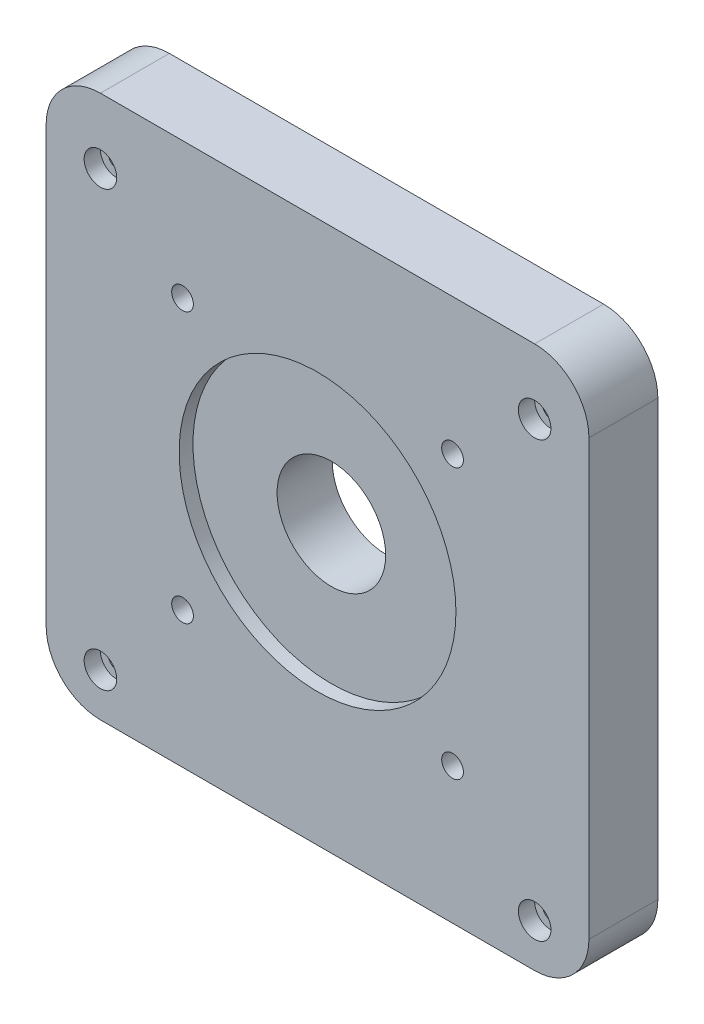
ISO-10303-21;
HEADER;
FILE_DESCRIPTION(('STEP AP214'),'2;1');
FILE_NAME('part.step','',(''),(''),'','','');
FILE_SCHEMA(('AUTOMOTIVE_DESIGN { 1 0 10303 214 1 1 1 1 }'));
ENDSEC;
DATA;
#1=APPLICATION_CONTEXT('core data for automotive mechanical design processes');
#2=APPLICATION_PROTOCOL_DEFINITION('international standard','automotive_design',2000,#1);
#3=PRODUCT_CONTEXT('',#1,'mechanical');
#4=PRODUCT('Part','Part','',(#3));
#5=PRODUCT_RELATED_PRODUCT_CATEGORY('part','',(#4));
#6=PRODUCT_DEFINITION_FORMATION('','',#4);
#7=PRODUCT_DEFINITION_CONTEXT('part definition',#1,'design');
#8=PRODUCT_DEFINITION('design','',#6,#7);
#9=PRODUCT_DEFINITION_SHAPE('','',#8);
#10=(LENGTH_UNIT() NAMED_UNIT(*) SI_UNIT(.MILLI.,.METRE.));
#11=(NAMED_UNIT(*) PLANE_ANGLE_UNIT() SI_UNIT($,.RADIAN.));
#12=(NAMED_UNIT(*) SI_UNIT($,.STERADIAN.) SOLID_ANGLE_UNIT());
#13=UNCERTAINTY_MEASURE_WITH_UNIT(LENGTH_MEASURE(1.E-05),#10,'distance_accuracy_value','');
#14=(GEOMETRIC_REPRESENTATION_CONTEXT(3) GLOBAL_UNCERTAINTY_ASSIGNED_CONTEXT((#13)) GLOBAL_UNIT_ASSIGNED_CONTEXT((#10,
#11,#12)) REPRESENTATION_CONTEXT('',''));
#15=CARTESIAN_POINT('',(0.,0.,0.));
#16=DIRECTION('',(0.,0.,1.));
#17=DIRECTION('',(1.,0.,0.));
#18=AXIS2_PLACEMENT_3D('',#15,#16,#17);
#19=CARTESIAN_POINT('',(50.,50.,-18.3));
#20=DIRECTION('',(0.,0.,1.));
#21=DIRECTION('',(1.,0.,0.));
#22=AXIS2_PLACEMENT_3D('',#19,#20,#21);
#23=CYLINDRICAL_SURFACE('',#22,9.99999999999999);
#24=CARTESIAN_POINT('',(50.,50.,0.));
#25=DIRECTION('',(0.,0.,-1.));
#26=DIRECTION('',(-1.,0.,0.));
#27=AXIS2_PLACEMENT_3D('',#24,#25,#26);
#28=CIRCLE('',#27,9.99999999999999);
#29=CARTESIAN_POINT('',(40.,50.,0.));
#30=VERTEX_POINT('',#29);
#31=EDGE_CURVE('E188',#30,#30,#28,.T.);
#32=ORIENTED_EDGE('',*,*,#31,.T.);
#33=EDGE_LOOP('',(#32));
#34=FACE_BOUND('',#33,.T.);
#35=CARTESIAN_POINT('',(50.,50.,10.15));
#36=DIRECTION('',(0.,0.,1.));
#37=DIRECTION('',(1.,0.,0.));
#38=AXIS2_PLACEMENT_3D('',#35,#36,#37);
#39=CIRCLE('',#38,9.99999999999999);
#40=CARTESIAN_POINT('',(60.,50.,10.15));
#41=VERTEX_POINT('',#40);
#42=EDGE_CURVE('E47',#41,#41,#39,.F.);
#43=ORIENTED_EDGE('',*,*,#42,.F.);
#44=EDGE_LOOP('',(#43));
#45=FACE_BOUND('',#44,.T.);
#46=ADVANCED_FACE('F43',(#34,#45),#23,.F.);
#47=CARTESIAN_POINT('',(25.125,74.875,-18.3));
#48=DIRECTION('',(0.,0.,1.));
#49=DIRECTION('',(1.,0.,0.));
#50=AXIS2_PLACEMENT_3D('',#47,#48,#49);
#51=CYLINDRICAL_SURFACE('',#50,2.);
#52=CARTESIAN_POINT('',(25.125,74.875,12.7));
#53=DIRECTION('',(0.,0.,1.));
#54=DIRECTION('',(1.,0.,0.));
#55=AXIS2_PLACEMENT_3D('',#52,#53,#54);
#56=CIRCLE('',#55,2.);
#57=CARTESIAN_POINT('',(27.125,74.875,12.7));
#58=VERTEX_POINT('',#57);
#59=EDGE_CURVE('E193',#58,#58,#56,.T.);
#60=ORIENTED_EDGE('',*,*,#59,.T.);
#61=EDGE_LOOP('',(#60));
#62=FACE_BOUND('',#61,.T.);
#63=CARTESIAN_POINT('',(25.125,74.875,3.));
#64=DIRECTION('',(0.,0.,-1.));
#65=DIRECTION('',(-1.,0.,0.));
#66=AXIS2_PLACEMENT_3D('',#63,#64,#65);
#67=CIRCLE('',#66,2.);
#68=CARTESIAN_POINT('',(23.125,74.875,3.));
#69=VERTEX_POINT('',#68);
#70=EDGE_CURVE('E224',#69,#69,#67,.F.);
#71=ORIENTED_EDGE('',*,*,#70,.F.);
#72=EDGE_LOOP('',(#71));
#73=FACE_BOUND('',#72,.T.);
#74=ADVANCED_FACE('F351',(#62,#73),#51,.F.);
#75=CARTESIAN_POINT('',(74.875,74.875,-18.3));
#76=DIRECTION('',(0.,0.,1.));
#77=DIRECTION('',(1.,0.,0.));
#78=AXIS2_PLACEMENT_3D('',#75,#76,#77);
#79=CYLINDRICAL_SURFACE('',#78,2.);
#80=CARTESIAN_POINT('',(74.875,74.875,12.7));
#81=DIRECTION('',(0.,0.,1.));
#82=DIRECTION('',(1.,0.,0.));
#83=AXIS2_PLACEMENT_3D('',#80,#81,#82);
#84=CIRCLE('',#83,2.);
#85=CARTESIAN_POINT('',(76.875,74.875,12.7));
#86=VERTEX_POINT('',#85);
#87=EDGE_CURVE('E248',#86,#86,#84,.T.);
#88=ORIENTED_EDGE('',*,*,#87,.T.);
#89=EDGE_LOOP('',(#88));
#90=FACE_BOUND('',#89,.T.);
#91=CARTESIAN_POINT('',(74.875,74.875,3.));
#92=DIRECTION('',(0.,0.,-1.));
#93=DIRECTION('',(-1.,0.,0.));
#94=AXIS2_PLACEMENT_3D('',#91,#92,#93);
#95=CIRCLE('',#94,2.);
#96=CARTESIAN_POINT('',(72.875,74.875,3.));
#97=VERTEX_POINT('',#96);
#98=EDGE_CURVE('E221',#97,#97,#95,.F.);
#99=ORIENTED_EDGE('',*,*,#98,.F.);
#100=EDGE_LOOP('',(#99));
#101=FACE_BOUND('',#100,.T.);
#102=ADVANCED_FACE('F357',(#90,#101),#79,.F.);
#103=CARTESIAN_POINT('',(25.125,25.125,-18.3));
#104=DIRECTION('',(0.,0.,1.));
#105=DIRECTION('',(1.,0.,0.));
#106=AXIS2_PLACEMENT_3D('',#103,#104,#105);
#107=CYLINDRICAL_SURFACE('',#106,2.);
#108=CARTESIAN_POINT('',(25.125,25.125,12.7));
#109=DIRECTION('',(0.,0.,1.));
#110=DIRECTION('',(1.,0.,0.));
#111=AXIS2_PLACEMENT_3D('',#108,#109,#110);
#112=CIRCLE('',#111,2.);
#113=CARTESIAN_POINT('',(27.125,25.125,12.7));
#114=VERTEX_POINT('',#113);
#115=EDGE_CURVE('E252',#114,#114,#112,.T.);
#116=ORIENTED_EDGE('',*,*,#115,.T.);
#117=EDGE_LOOP('',(#116));
#118=FACE_BOUND('',#117,.T.);
#119=CARTESIAN_POINT('',(25.125,25.125,3.));
#120=DIRECTION('',(0.,0.,-1.));
#121=DIRECTION('',(-1.,0.,0.));
#122=AXIS2_PLACEMENT_3D('',#119,#120,#121);
#123=CIRCLE('',#122,2.);
#124=CARTESIAN_POINT('',(23.125,25.125,3.));
#125=VERTEX_POINT('',#124);
#126=EDGE_CURVE('E216',#125,#125,#123,.F.);
#127=ORIENTED_EDGE('',*,*,#126,.F.);
#128=EDGE_LOOP('',(#127));
#129=FACE_BOUND('',#128,.T.);
#130=ADVANCED_FACE('F442',(#118,#129),#107,.F.);
#131=CARTESIAN_POINT('',(74.875,25.125,-18.3));
#132=DIRECTION('',(0.,0.,1.));
#133=DIRECTION('',(1.,0.,0.));
#134=AXIS2_PLACEMENT_3D('',#131,#132,#133);
#135=CYLINDRICAL_SURFACE('',#134,2.);
#136=CARTESIAN_POINT('',(74.875,25.125,12.7));
#137=DIRECTION('',(0.,0.,1.));
#138=DIRECTION('',(1.,0.,0.));
#139=AXIS2_PLACEMENT_3D('',#136,#137,#138);
#140=CIRCLE('',#139,2.);
#141=CARTESIAN_POINT('',(76.875,25.125,12.7));
#142=VERTEX_POINT('',#141);
#143=EDGE_CURVE('E211',#142,#142,#140,.T.);
#144=ORIENTED_EDGE('',*,*,#143,.T.);
#145=EDGE_LOOP('',(#144));
#146=FACE_BOUND('',#145,.T.);
#147=CARTESIAN_POINT('',(74.875,25.125,3.));
#148=DIRECTION('',(0.,0.,-1.));
#149=DIRECTION('',(-1.,0.,0.));
#150=AXIS2_PLACEMENT_3D('',#147,#148,#149);
#151=CIRCLE('',#150,2.);
#152=CARTESIAN_POINT('',(72.875,25.125,3.));
#153=VERTEX_POINT('',#152);
#154=EDGE_CURVE('E212',#153,#153,#151,.F.);
#155=ORIENTED_EDGE('',*,*,#154,.F.);
#156=EDGE_LOOP('',(#155));
#157=FACE_BOUND('',#156,.T.);
#158=ADVANCED_FACE('F362',(#146,#157),#135,.F.);
#159=CARTESIAN_POINT('',(90.,90.,12.7));
#160=DIRECTION('',(0.,0.,-1.));
#161=DIRECTION('',(-1.,0.,0.));
#162=AXIS2_PLACEMENT_3D('',#159,#160,#161);
#163=CYLINDRICAL_SURFACE('',#162,9.99999999999999);
#164=CARTESIAN_POINT('',(90.,90.,0.));
#165=DIRECTION('',(0.,0.,1.));
#166=DIRECTION('',(-1.,0.,0.));
#167=AXIS2_PLACEMENT_3D('',#164,#165,#166);
#168=CIRCLE('',#167,9.99999999999999);
#169=CARTESIAN_POINT('',(100.,89.9999999999999,0.));
#170=VERTEX_POINT('',#169);
#171=CARTESIAN_POINT('',(89.9999999999999,100.,0.));
#172=VERTEX_POINT('',#171);
#173=EDGE_CURVE('E147',#170,#172,#168,.T.);
#174=ORIENTED_EDGE('',*,*,#173,.T.);
#175=DIRECTION('',(0.,0.,-1.));
#176=VECTOR('',#175,1.);
#177=CARTESIAN_POINT('',(89.9999999999999,100.,12.7));
#178=LINE('',#177,#176);
#179=CARTESIAN_POINT('',(89.9999999999999,100.,12.7));
#180=VERTEX_POINT('',#179);
#181=EDGE_CURVE('E11',#180,#172,#178,.T.);
#182=ORIENTED_EDGE('',*,*,#181,.F.);
#183=CARTESIAN_POINT('',(90.,90.,12.7));
#184=DIRECTION('',(0.,0.,1.));
#185=DIRECTION('',(-1.,0.,0.));
#186=AXIS2_PLACEMENT_3D('',#183,#184,#185);
#187=CIRCLE('',#186,9.99999999999999);
#188=CARTESIAN_POINT('',(100.,89.9999999999999,12.7));
#189=VERTEX_POINT('',#188);
#190=EDGE_CURVE('E170',#189,#180,#187,.T.);
#191=ORIENTED_EDGE('',*,*,#190,.F.);
#192=DIRECTION('',(0.,0.,-1.));
#193=VECTOR('',#192,1.);
#194=CARTESIAN_POINT('',(100.,89.9999999999999,12.7));
#195=LINE('',#194,#193);
#196=EDGE_CURVE('E143',#189,#170,#195,.T.);
#197=ORIENTED_EDGE('',*,*,#196,.T.);
#198=EDGE_LOOP('',(#174,#182,#191,#197));
#199=FACE_BOUND('',#198,.T.);
#200=ADVANCED_FACE('F45',(#199),#163,.T.);
#201=CARTESIAN_POINT('',(10.0000000000001,100.,12.7));
#202=DIRECTION('',(0.,-1.,0.));
#203=DIRECTION('',(0.,0.,-1.));
#204=AXIS2_PLACEMENT_3D('',#201,#202,#203);
#205=PLANE('',#204);
#206=DIRECTION('',(-1.,0.,0.));
#207=VECTOR('',#206,1.);
#208=CARTESIAN_POINT('',(10.0000000000001,100.,0.));
#209=LINE('',#208,#207);
#210=CARTESIAN_POINT('',(10.0000000000001,100.,0.));
#211=VERTEX_POINT('',#210);
#212=EDGE_CURVE('E151',#172,#211,#209,.T.);
#213=ORIENTED_EDGE('',*,*,#212,.T.);
#214=DIRECTION('',(0.,0.,-1.));
#215=VECTOR('',#214,1.);
#216=CARTESIAN_POINT('',(10.0000000000001,100.,12.7));
#217=LINE('',#216,#215);
#218=CARTESIAN_POINT('',(10.0000000000001,100.,12.7));
#219=VERTEX_POINT('',#218);
#220=EDGE_CURVE('E54',#219,#211,#217,.T.);
#221=ORIENTED_EDGE('',*,*,#220,.F.);
#222=DIRECTION('',(-1.,0.,0.));
#223=VECTOR('',#222,1.);
#224=CARTESIAN_POINT('',(10.0000000000001,100.,12.7));
#225=LINE('',#224,#223);
#226=EDGE_CURVE('E106',#180,#219,#225,.T.);
#227=ORIENTED_EDGE('',*,*,#226,.F.);
#228=ORIENTED_EDGE('',*,*,#181,.T.);
#229=EDGE_LOOP('',(#213,#221,#227,#228));
#230=FACE_BOUND('',#229,.T.);
#231=ADVANCED_FACE('F421',(#230),#205,.F.);
#232=CARTESIAN_POINT('',(10.,90.,12.7));
#233=DIRECTION('',(0.,0.,-1.));
#234=DIRECTION('',(-1.,0.,0.));
#235=AXIS2_PLACEMENT_3D('',#232,#233,#234);
#236=CYLINDRICAL_SURFACE('',#235,10.);
#237=CARTESIAN_POINT('',(10.,90.,0.));
#238=DIRECTION('',(0.,0.,1.));
#239=DIRECTION('',(-1.,0.,0.));
#240=AXIS2_PLACEMENT_3D('',#237,#238,#239);
#241=CIRCLE('',#240,10.);
#242=CARTESIAN_POINT('',(0.,89.9999999999999,0.));
#243=VERTEX_POINT('',#242);
#244=EDGE_CURVE('E155',#211,#243,#241,.T.);
#245=ORIENTED_EDGE('',*,*,#244,.T.);
#246=DIRECTION('',(0.,0.,-1.));
#247=VECTOR('',#246,1.);
#248=CARTESIAN_POINT('',(0.,89.9999999999999,12.7));
#249=LINE('',#248,#247);
#250=CARTESIAN_POINT('',(0.,89.9999999999999,12.7));
#251=VERTEX_POINT('',#250);
#252=EDGE_CURVE('E181',#251,#243,#249,.T.);
#253=ORIENTED_EDGE('',*,*,#252,.F.);
#254=CARTESIAN_POINT('',(10.,90.,12.7));
#255=DIRECTION('',(0.,0.,1.));
#256=DIRECTION('',(-1.,0.,0.));
#257=AXIS2_PLACEMENT_3D('',#254,#255,#256);
#258=CIRCLE('',#257,10.);
#259=EDGE_CURVE('E293',#219,#251,#258,.T.);
#260=ORIENTED_EDGE('',*,*,#259,.F.);
#261=ORIENTED_EDGE('',*,*,#220,.T.);
#262=EDGE_LOOP('',(#245,#253,#260,#261));
#263=FACE_BOUND('',#262,.T.);
#264=ADVANCED_FACE('F418',(#263),#236,.T.);
#265=CARTESIAN_POINT('',(0.,10.0000000000001,12.7));
#266=DIRECTION('',(1.,0.,0.));
#267=DIRECTION('',(0.,0.,-1.));
#268=AXIS2_PLACEMENT_3D('',#265,#266,#267);
#269=PLANE('',#268);
#270=DIRECTION('',(0.,-1.,0.));
#271=VECTOR('',#270,1.);
#272=CARTESIAN_POINT('',(0.,10.0000000000001,0.));
#273=LINE('',#272,#271);
#274=CARTESIAN_POINT('',(0.,10.0000000000001,0.));
#275=VERTEX_POINT('',#274);
#276=EDGE_CURVE('E158',#243,#275,#273,.T.);
#277=ORIENTED_EDGE('',*,*,#276,.T.);
#278=DIRECTION('',(0.,0.,-1.));
#279=VECTOR('',#278,1.);
#280=CARTESIAN_POINT('',(0.,10.0000000000001,12.7));
#281=LINE('',#280,#279);
#282=CARTESIAN_POINT('',(0.,10.0000000000001,12.7));
#283=VERTEX_POINT('',#282);
#284=EDGE_CURVE('E177',#283,#275,#281,.T.);
#285=ORIENTED_EDGE('',*,*,#284,.F.);
#286=DIRECTION('',(0.,-1.,0.));
#287=VECTOR('',#286,1.);
#288=CARTESIAN_POINT('',(0.,10.0000000000001,12.7));
#289=LINE('',#288,#287);
#290=EDGE_CURVE('E296',#251,#283,#289,.T.);
#291=ORIENTED_EDGE('',*,*,#290,.F.);
#292=ORIENTED_EDGE('',*,*,#252,.T.);
#293=EDGE_LOOP('',(#277,#285,#291,#292));
#294=FACE_BOUND('',#293,.T.);
#295=ADVANCED_FACE('F414',(#294),#269,.F.);
#296=CARTESIAN_POINT('',(10.,10.,12.7));
#297=DIRECTION('',(0.,0.,-1.));
#298=DIRECTION('',(-1.,0.,0.));
#299=AXIS2_PLACEMENT_3D('',#296,#297,#298);
#300=CYLINDRICAL_SURFACE('',#299,10.);
#301=CARTESIAN_POINT('',(10.,10.,0.));
#302=DIRECTION('',(0.,0.,1.));
#303=DIRECTION('',(-1.,0.,0.));
#304=AXIS2_PLACEMENT_3D('',#301,#302,#303);
#305=CIRCLE('',#304,10.);
#306=CARTESIAN_POINT('',(10.0000000000001,0.,0.));
#307=VERTEX_POINT('',#306);
#308=EDGE_CURVE('E161',#275,#307,#305,.T.);
#309=ORIENTED_EDGE('',*,*,#308,.T.);
#310=DIRECTION('',(0.,0.,-1.));
#311=VECTOR('',#310,1.);
#312=CARTESIAN_POINT('',(10.0000000000001,0.,12.7));
#313=LINE('',#312,#311);
#314=CARTESIAN_POINT('',(10.0000000000001,0.,12.7));
#315=VERTEX_POINT('',#314);
#316=EDGE_CURVE('E136',#315,#307,#313,.T.);
#317=ORIENTED_EDGE('',*,*,#316,.F.);
#318=CARTESIAN_POINT('',(10.,10.,12.7));
#319=DIRECTION('',(0.,0.,1.));
#320=DIRECTION('',(-1.,0.,0.));
#321=AXIS2_PLACEMENT_3D('',#318,#319,#320);
#322=CIRCLE('',#321,10.);
#323=EDGE_CURVE('E125',#283,#315,#322,.T.);
#324=ORIENTED_EDGE('',*,*,#323,.F.);
#325=ORIENTED_EDGE('',*,*,#284,.T.);
#326=EDGE_LOOP('',(#309,#317,#324,#325));
#327=FACE_BOUND('',#326,.T.);
#328=ADVANCED_FACE('F411',(#327),#300,.T.);
#329=CARTESIAN_POINT('',(10.0000000000001,0.,12.7));
#330=DIRECTION('',(0.,1.,0.));
#331=DIRECTION('',(0.,0.,1.));
#332=AXIS2_PLACEMENT_3D('',#329,#330,#331);
#333=PLANE('',#332);
#334=DIRECTION('',(1.,0.,0.));
#335=VECTOR('',#334,1.);
#336=CARTESIAN_POINT('',(10.0000000000001,0.,0.));
#337=LINE('',#336,#335);
#338=CARTESIAN_POINT('',(89.9999999999999,0.,0.));
#339=VERTEX_POINT('',#338);
#340=EDGE_CURVE('E134',#307,#339,#337,.T.);
#341=ORIENTED_EDGE('',*,*,#340,.T.);
#342=DIRECTION('',(0.,0.,-1.));
#343=VECTOR('',#342,1.);
#344=CARTESIAN_POINT('',(89.9999999999999,0.,12.7));
#345=LINE('',#344,#343);
#346=CARTESIAN_POINT('',(89.9999999999999,0.,12.7));
#347=VERTEX_POINT('',#346);
#348=EDGE_CURVE('E131',#347,#339,#345,.T.);
#349=ORIENTED_EDGE('',*,*,#348,.F.);
#350=DIRECTION('',(1.,0.,0.));
#351=VECTOR('',#350,1.);
#352=CARTESIAN_POINT('',(10.0000000000001,0.,12.7));
#353=LINE('',#352,#351);
#354=EDGE_CURVE('E119',#315,#347,#353,.T.);
#355=ORIENTED_EDGE('',*,*,#354,.F.);
#356=ORIENTED_EDGE('',*,*,#316,.T.);
#357=EDGE_LOOP('',(#341,#349,#355,#356));
#358=FACE_BOUND('',#357,.T.);
#359=ADVANCED_FACE('F132',(#358),#333,.F.);
#360=CARTESIAN_POINT('',(90.,10.,12.7));
#361=DIRECTION('',(0.,0.,-1.));
#362=DIRECTION('',(-1.,0.,0.));
#363=AXIS2_PLACEMENT_3D('',#360,#361,#362);
#364=CYLINDRICAL_SURFACE('',#363,10.);
#365=CARTESIAN_POINT('',(90.,10.,0.));
#366=DIRECTION('',(0.,0.,1.));
#367=DIRECTION('',(1.,0.,0.));
#368=AXIS2_PLACEMENT_3D('',#365,#366,#367);
#369=CIRCLE('',#368,10.);
#370=CARTESIAN_POINT('',(100.,10.,0.));
#371=VERTEX_POINT('',#370);
#372=EDGE_CURVE('E92',#339,#371,#369,.T.);
#373=ORIENTED_EDGE('',*,*,#372,.T.);
#374=DIRECTION('',(0.,0.,-1.));
#375=VECTOR('',#374,1.);
#376=CARTESIAN_POINT('',(100.,10.,12.7));
#377=LINE('',#376,#375);
#378=CARTESIAN_POINT('',(100.,10.,12.7));
#379=VERTEX_POINT('',#378);
#380=EDGE_CURVE('E137',#379,#371,#377,.T.);
#381=ORIENTED_EDGE('',*,*,#380,.F.);
#382=CARTESIAN_POINT('',(90.,10.,12.7));
#383=DIRECTION('',(0.,0.,1.));
#384=DIRECTION('',(1.,0.,0.));
#385=AXIS2_PLACEMENT_3D('',#382,#383,#384);
#386=CIRCLE('',#385,10.);
#387=EDGE_CURVE('E123',#347,#379,#386,.T.);
#388=ORIENTED_EDGE('',*,*,#387,.F.);
#389=ORIENTED_EDGE('',*,*,#348,.T.);
#390=EDGE_LOOP('',(#373,#381,#388,#389));
#391=FACE_BOUND('',#390,.T.);
#392=ADVANCED_FACE('F139',(#391),#364,.T.);
#393=CARTESIAN_POINT('',(100.,10.0000000000001,12.7));
#394=DIRECTION('',(-1.,0.,0.));
#395=DIRECTION('',(0.,0.,1.));
#396=AXIS2_PLACEMENT_3D('',#393,#394,#395);
#397=PLANE('',#396);
#398=DIRECTION('',(0.,1.,0.));
#399=VECTOR('',#398,1.);
#400=CARTESIAN_POINT('',(100.,10.0000000000001,0.));
#401=LINE('',#400,#399);
#402=EDGE_CURVE('E98',#371,#170,#401,.T.);
#403=ORIENTED_EDGE('',*,*,#402,.T.);
#404=ORIENTED_EDGE('',*,*,#196,.F.);
#405=DIRECTION('',(0.,1.,0.));
#406=VECTOR('',#405,1.);
#407=CARTESIAN_POINT('',(100.,10.0000000000001,12.7));
#408=LINE('',#407,#406);
#409=EDGE_CURVE('E63',#379,#189,#408,.T.);
#410=ORIENTED_EDGE('',*,*,#409,.F.);
#411=ORIENTED_EDGE('',*,*,#380,.T.);
#412=EDGE_LOOP('',(#403,#404,#410,#411));
#413=FACE_BOUND('',#412,.T.);
#414=ADVANCED_FACE('F400',(#413),#397,.F.);
#415=CARTESIAN_POINT('',(90.,90.,12.7));
#416=DIRECTION('',(0.,0.,-1.));
#417=DIRECTION('',(-1.,0.,0.));
#418=AXIS2_PLACEMENT_3D('',#415,#416,#417);
#419=PLANE('',#418);
#420=CARTESIAN_POINT('',(50.,50.,12.7));
#421=DIRECTION('',(0.,0.,1.));
#422=DIRECTION('',(1.,0.,0.));
#423=AXIS2_PLACEMENT_3D('',#420,#421,#422);
#424=CIRCLE('',#423,25.5);
#425=CARTESIAN_POINT('',(75.5,50.,12.7));
#426=VERTEX_POINT('',#425);
#427=EDGE_CURVE('E335',#426,#426,#424,.T.);
#428=ORIENTED_EDGE('',*,*,#427,.F.);
#429=EDGE_LOOP('',(#428));
#430=FACE_BOUND('',#429,.T.);
#431=ORIENTED_EDGE('',*,*,#143,.F.);
#432=EDGE_LOOP('',(#431));
#433=FACE_BOUND('',#432,.T.);
#434=ORIENTED_EDGE('',*,*,#115,.F.);
#435=EDGE_LOOP('',(#434));
#436=FACE_BOUND('',#435,.T.);
#437=ORIENTED_EDGE('',*,*,#87,.F.);
#438=EDGE_LOOP('',(#437));
#439=FACE_BOUND('',#438,.T.);
#440=ORIENTED_EDGE('',*,*,#59,.F.);
#441=EDGE_LOOP('',(#440));
#442=FACE_BOUND('',#441,.T.);
#443=CARTESIAN_POINT('',(10.,7.99999999999999,12.7));
#444=DIRECTION('',(0.,0.,1.));
#445=DIRECTION('',(1.,0.,0.));
#446=AXIS2_PLACEMENT_3D('',#443,#444,#445);
#447=CIRCLE('',#446,3.);
#448=CARTESIAN_POINT('',(13.,7.99999999999999,12.7));
#449=VERTEX_POINT('',#448);
#450=EDGE_CURVE('E267',#449,#449,#447,.T.);
#451=ORIENTED_EDGE('',*,*,#450,.F.);
#452=EDGE_LOOP('',(#451));
#453=FACE_BOUND('',#452,.T.);
#454=CARTESIAN_POINT('',(90.,88.,12.7));
#455=DIRECTION('',(0.,0.,1.));
#456=DIRECTION('',(1.,0.,0.));
#457=AXIS2_PLACEMENT_3D('',#454,#455,#456);
#458=CIRCLE('',#457,3.00000000000001);
#459=CARTESIAN_POINT('',(93.,88.,12.7));
#460=VERTEX_POINT('',#459);
#461=EDGE_CURVE('E276',#460,#460,#458,.T.);
#462=ORIENTED_EDGE('',*,*,#461,.F.);
#463=EDGE_LOOP('',(#462));
#464=FACE_BOUND('',#463,.T.);
#465=CARTESIAN_POINT('',(90.,7.99999999999999,12.7));
#466=DIRECTION('',(0.,0.,1.));
#467=DIRECTION('',(1.,0.,0.));
#468=AXIS2_PLACEMENT_3D('',#465,#466,#467);
#469=CIRCLE('',#468,3.00000000000001);
#470=CARTESIAN_POINT('',(93.,7.99999999999999,12.7));
#471=VERTEX_POINT('',#470);
#472=EDGE_CURVE('E259',#471,#471,#469,.T.);
#473=ORIENTED_EDGE('',*,*,#472,.F.);
#474=EDGE_LOOP('',(#473));
#475=FACE_BOUND('',#474,.T.);
#476=CARTESIAN_POINT('',(10.,88.,12.7));
#477=DIRECTION('',(0.,0.,1.));
#478=DIRECTION('',(1.,0.,0.));
#479=AXIS2_PLACEMENT_3D('',#476,#477,#478);
#480=CIRCLE('',#479,3.);
#481=CARTESIAN_POINT('',(13.,88.,12.7));
#482=VERTEX_POINT('',#481);
#483=EDGE_CURVE('E271',#482,#482,#480,.T.);
#484=ORIENTED_EDGE('',*,*,#483,.F.);
#485=EDGE_LOOP('',(#484));
#486=FACE_BOUND('',#485,.T.);
#487=ORIENTED_EDGE('',*,*,#190,.T.);
#488=ORIENTED_EDGE('',*,*,#226,.T.);
#489=ORIENTED_EDGE('',*,*,#259,.T.);
#490=ORIENTED_EDGE('',*,*,#290,.T.);
#491=ORIENTED_EDGE('',*,*,#323,.T.);
#492=ORIENTED_EDGE('',*,*,#354,.T.);
#493=ORIENTED_EDGE('',*,*,#387,.T.);
#494=ORIENTED_EDGE('',*,*,#409,.T.);
#495=EDGE_LOOP('',(#487,#488,#489,#490,#491,#492,#493,#494));
#496=FACE_BOUND('',#495,.T.);
#497=ADVANCED_FACE('F121',(#430,#433,#436,#439,#442,#453,#464,#475,#486,#496),#419,.F.);
#498=CARTESIAN_POINT('',(90.,90.,0.));
#499=DIRECTION('',(0.,0.,-1.));
#500=DIRECTION('',(-1.,0.,0.));
#501=AXIS2_PLACEMENT_3D('',#498,#499,#500);
#502=PLANE('',#501);
#503=CARTESIAN_POINT('',(74.875,25.125,0.));
#504=DIRECTION('',(0.,0.,-1.));
#505=DIRECTION('',(-1.,0.,0.));
#506=AXIS2_PLACEMENT_3D('',#503,#504,#505);
#507=CIRCLE('',#506,4.00000000000001);
#508=CARTESIAN_POINT('',(70.875,25.125,0.));
#509=VERTEX_POINT('',#508);
#510=EDGE_CURVE('E316',#509,#509,#507,.T.);
#511=ORIENTED_EDGE('',*,*,#510,.F.);
#512=EDGE_LOOP('',(#511));
#513=FACE_BOUND('',#512,.T.);
#514=CARTESIAN_POINT('',(25.125,25.125,0.));
#515=DIRECTION('',(0.,0.,-1.));
#516=DIRECTION('',(-1.,0.,0.));
#517=AXIS2_PLACEMENT_3D('',#514,#515,#516);
#518=CIRCLE('',#517,4.);
#519=CARTESIAN_POINT('',(21.125,25.125,0.));
#520=VERTEX_POINT('',#519);
#521=EDGE_CURVE('E324',#520,#520,#518,.T.);
#522=ORIENTED_EDGE('',*,*,#521,.F.);
#523=EDGE_LOOP('',(#522));
#524=FACE_BOUND('',#523,.T.);
#525=CARTESIAN_POINT('',(25.125,74.875,0.));
#526=DIRECTION('',(0.,0.,-1.));
#527=DIRECTION('',(-1.,0.,0.));
#528=AXIS2_PLACEMENT_3D('',#525,#526,#527);
#529=CIRCLE('',#528,4.);
#530=CARTESIAN_POINT('',(21.125,74.875,0.));
#531=VERTEX_POINT('',#530);
#532=EDGE_CURVE('E308',#531,#531,#529,.T.);
#533=ORIENTED_EDGE('',*,*,#532,.F.);
#534=EDGE_LOOP('',(#533));
#535=FACE_BOUND('',#534,.T.);
#536=CARTESIAN_POINT('',(74.875,74.875,0.));
#537=DIRECTION('',(0.,0.,-1.));
#538=DIRECTION('',(-1.,0.,0.));
#539=AXIS2_PLACEMENT_3D('',#536,#537,#538);
#540=CIRCLE('',#539,4.00000000000001);
#541=CARTESIAN_POINT('',(70.875,74.875,0.));
#542=VERTEX_POINT('',#541);
#543=EDGE_CURVE('E304',#542,#542,#540,.T.);
#544=ORIENTED_EDGE('',*,*,#543,.F.);
#545=EDGE_LOOP('',(#544));
#546=FACE_BOUND('',#545,.T.);
#547=CARTESIAN_POINT('',(10.,7.99999999999999,0.));
#548=DIRECTION('',(0.,0.,-1.));
#549=DIRECTION('',(-1.,0.,0.));
#550=AXIS2_PLACEMENT_3D('',#547,#548,#549);
#551=CIRCLE('',#550,1.5);
#552=CARTESIAN_POINT('',(8.5,7.99999999999999,0.));
#553=VERTEX_POINT('',#552);
#554=EDGE_CURVE('E207',#553,#553,#551,.T.);
#555=ORIENTED_EDGE('',*,*,#554,.F.);
#556=EDGE_LOOP('',(#555));
#557=FACE_BOUND('',#556,.T.);
#558=CARTESIAN_POINT('',(90.,7.99999999999999,0.));
#559=DIRECTION('',(0.,0.,-1.));
#560=DIRECTION('',(-1.,0.,0.));
#561=AXIS2_PLACEMENT_3D('',#558,#559,#560);
#562=CIRCLE('',#561,1.5);
#563=CARTESIAN_POINT('',(88.5,7.99999999999999,0.));
#564=VERTEX_POINT('',#563);
#565=EDGE_CURVE('E203',#564,#564,#562,.T.);
#566=ORIENTED_EDGE('',*,*,#565,.F.);
#567=EDGE_LOOP('',(#566));
#568=FACE_BOUND('',#567,.T.);
#569=CARTESIAN_POINT('',(90.,88.,0.));
#570=DIRECTION('',(0.,0.,-1.));
#571=DIRECTION('',(-1.,0.,0.));
#572=AXIS2_PLACEMENT_3D('',#569,#570,#571);
#573=CIRCLE('',#572,1.5);
#574=CARTESIAN_POINT('',(88.5,88.,0.));
#575=VERTEX_POINT('',#574);
#576=EDGE_CURVE('E198',#575,#575,#573,.T.);
#577=ORIENTED_EDGE('',*,*,#576,.F.);
#578=EDGE_LOOP('',(#577));
#579=FACE_BOUND('',#578,.T.);
#580=CARTESIAN_POINT('',(10.,88.,0.));
#581=DIRECTION('',(0.,0.,-1.));
#582=DIRECTION('',(-1.,0.,0.));
#583=AXIS2_PLACEMENT_3D('',#580,#581,#582);
#584=CIRCLE('',#583,1.5);
#585=CARTESIAN_POINT('',(8.5,88.,0.));
#586=VERTEX_POINT('',#585);
#587=EDGE_CURVE('E194',#586,#586,#584,.T.);
#588=ORIENTED_EDGE('',*,*,#587,.F.);
#589=EDGE_LOOP('',(#588));
#590=FACE_BOUND('',#589,.T.);
#591=ORIENTED_EDGE('',*,*,#31,.F.);
#592=EDGE_LOOP('',(#591));
#593=FACE_BOUND('',#592,.T.);
#594=ORIENTED_EDGE('',*,*,#173,.F.);
#595=ORIENTED_EDGE('',*,*,#402,.F.);
#596=ORIENTED_EDGE('',*,*,#372,.F.);
#597=ORIENTED_EDGE('',*,*,#340,.F.);
#598=ORIENTED_EDGE('',*,*,#308,.F.);
#599=ORIENTED_EDGE('',*,*,#276,.F.);
#600=ORIENTED_EDGE('',*,*,#244,.F.);
#601=ORIENTED_EDGE('',*,*,#212,.F.);
#602=EDGE_LOOP('',(#594,#595,#596,#597,#598,#599,#600,#601));
#603=FACE_BOUND('',#602,.T.);
#604=ADVANCED_FACE('F396',(#513,#524,#535,#546,#557,#568,#579,#590,#593,#603),#502,.T.);
#605=CARTESIAN_POINT('',(10.,88.,9.7));
#606=DIRECTION('',(0.,0.,1.));
#607=DIRECTION('',(1.,0.,0.));
#608=AXIS2_PLACEMENT_3D('',#605,#606,#607);
#609=CYLINDRICAL_SURFACE('',#608,3.);
#610=CARTESIAN_POINT('',(10.,88.,9.7));
#611=DIRECTION('',(0.,0.,1.));
#612=DIRECTION('',(1.,0.,0.));
#613=AXIS2_PLACEMENT_3D('',#610,#611,#612);
#614=CIRCLE('',#613,3.);
#615=CARTESIAN_POINT('',(13.,88.,9.7));
#616=VERTEX_POINT('',#615);
#617=EDGE_CURVE('E152',#616,#616,#614,.T.);
#618=ORIENTED_EDGE('',*,*,#617,.F.);
#619=EDGE_LOOP('',(#618));
#620=FACE_BOUND('',#619,.T.);
#621=ORIENTED_EDGE('',*,*,#483,.T.);
#622=EDGE_LOOP('',(#621));
#623=FACE_BOUND('',#622,.T.);
#624=ADVANCED_FACE('F392',(#620,#623),#609,.F.);
#625=CARTESIAN_POINT('',(10.,88.,9.7));
#626=DIRECTION('',(0.,0.,1.));
#627=DIRECTION('',(1.,0.,0.));
#628=AXIS2_PLACEMENT_3D('',#625,#626,#627);
#629=PLANE('',#628);
#630=CARTESIAN_POINT('',(10.,88.,9.7));
#631=DIRECTION('',(0.,0.,1.));
#632=DIRECTION('',(1.,0.,0.));
#633=AXIS2_PLACEMENT_3D('',#630,#631,#632);
#634=CIRCLE('',#633,1.5);
#635=CARTESIAN_POINT('',(11.5,88.,9.7));
#636=VERTEX_POINT('',#635);
#637=EDGE_CURVE('E199',#636,#636,#634,.T.);
#638=ORIENTED_EDGE('',*,*,#637,.F.);
#639=EDGE_LOOP('',(#638));
#640=FACE_BOUND('',#639,.T.);
#641=ORIENTED_EDGE('',*,*,#617,.T.);
#642=EDGE_LOOP('',(#641));
#643=FACE_BOUND('',#642,.T.);
#644=ADVANCED_FACE('F368',(#640,#643),#629,.T.);
#645=CARTESIAN_POINT('',(90.,7.99999999999999,9.7));
#646=DIRECTION('',(0.,0.,1.));
#647=DIRECTION('',(1.,0.,0.));
#648=AXIS2_PLACEMENT_3D('',#645,#646,#647);
#649=CYLINDRICAL_SURFACE('',#648,3.00000000000001);
#650=CARTESIAN_POINT('',(90.,7.99999999999999,9.7));
#651=DIRECTION('',(0.,0.,1.));
#652=DIRECTION('',(1.,0.,0.));
#653=AXIS2_PLACEMENT_3D('',#650,#651,#652);
#654=CIRCLE('',#653,3.00000000000001);
#655=CARTESIAN_POINT('',(93.,7.99999999999999,9.7));
#656=VERTEX_POINT('',#655);
#657=EDGE_CURVE('E192',#656,#656,#654,.T.);
#658=ORIENTED_EDGE('',*,*,#657,.F.);
#659=EDGE_LOOP('',(#658));
#660=FACE_BOUND('',#659,.T.);
#661=ORIENTED_EDGE('',*,*,#472,.T.);
#662=EDGE_LOOP('',(#661));
#663=FACE_BOUND('',#662,.T.);
#664=ADVANCED_FACE('F364',(#660,#663),#649,.F.);
#665=CARTESIAN_POINT('',(90.,7.99999999999999,9.7));
#666=DIRECTION('',(0.,0.,1.));
#667=DIRECTION('',(1.,0.,0.));
#668=AXIS2_PLACEMENT_3D('',#665,#666,#667);
#669=PLANE('',#668);
#670=CARTESIAN_POINT('',(90.,7.99999999999999,9.7));
#671=DIRECTION('',(0.,0.,1.));
#672=DIRECTION('',(1.,0.,0.));
#673=AXIS2_PLACEMENT_3D('',#670,#671,#672);
#674=CIRCLE('',#673,1.5);
#675=CARTESIAN_POINT('',(91.5,7.99999999999999,9.7));
#676=VERTEX_POINT('',#675);
#677=EDGE_CURVE('E232',#676,#676,#674,.T.);
#678=ORIENTED_EDGE('',*,*,#677,.F.);
#679=EDGE_LOOP('',(#678));
#680=FACE_BOUND('',#679,.T.);
#681=ORIENTED_EDGE('',*,*,#657,.T.);
#682=EDGE_LOOP('',(#681));
#683=FACE_BOUND('',#682,.T.);
#684=ADVANCED_FACE('F367',(#680,#683),#669,.T.);
#685=CARTESIAN_POINT('',(90.,88.,9.7));
#686=DIRECTION('',(0.,0.,1.));
#687=DIRECTION('',(1.,0.,0.));
#688=AXIS2_PLACEMENT_3D('',#685,#686,#687);
#689=CYLINDRICAL_SURFACE('',#688,3.00000000000001);
#690=CARTESIAN_POINT('',(90.,88.,9.7));
#691=DIRECTION('',(0.,0.,1.));
#692=DIRECTION('',(1.,0.,0.));
#693=AXIS2_PLACEMENT_3D('',#690,#691,#692);
#694=CIRCLE('',#693,3.00000000000001);
#695=CARTESIAN_POINT('',(93.,88.,9.7));
#696=VERTEX_POINT('',#695);
#697=EDGE_CURVE('E263',#696,#696,#694,.T.);
#698=ORIENTED_EDGE('',*,*,#697,.F.);
#699=EDGE_LOOP('',(#698));
#700=FACE_BOUND('',#699,.T.);
#701=ORIENTED_EDGE('',*,*,#461,.T.);
#702=EDGE_LOOP('',(#701));
#703=FACE_BOUND('',#702,.T.);
#704=ADVANCED_FACE('F372',(#700,#703),#689,.F.);
#705=CARTESIAN_POINT('',(90.,88.,9.7));
#706=DIRECTION('',(0.,0.,1.));
#707=DIRECTION('',(1.,0.,0.));
#708=AXIS2_PLACEMENT_3D('',#705,#706,#707);
#709=PLANE('',#708);
#710=CARTESIAN_POINT('',(90.,88.,9.7));
#711=DIRECTION('',(0.,0.,1.));
#712=DIRECTION('',(1.,0.,0.));
#713=AXIS2_PLACEMENT_3D('',#710,#711,#712);
#714=CIRCLE('',#713,1.5);
#715=CARTESIAN_POINT('',(91.5,88.,9.7));
#716=VERTEX_POINT('',#715);
#717=EDGE_CURVE('E238',#716,#716,#714,.T.);
#718=ORIENTED_EDGE('',*,*,#717,.F.);
#719=EDGE_LOOP('',(#718));
#720=FACE_BOUND('',#719,.T.);
#721=ORIENTED_EDGE('',*,*,#697,.T.);
#722=EDGE_LOOP('',(#721));
#723=FACE_BOUND('',#722,.T.);
#724=ADVANCED_FACE('F378',(#720,#723),#709,.T.);
#725=CARTESIAN_POINT('',(10.,7.99999999999999,9.7));
#726=DIRECTION('',(0.,0.,1.));
#727=DIRECTION('',(1.,0.,0.));
#728=AXIS2_PLACEMENT_3D('',#725,#726,#727);
#729=CYLINDRICAL_SURFACE('',#728,3.);
#730=CARTESIAN_POINT('',(10.,7.99999999999999,9.7));
#731=DIRECTION('',(0.,0.,1.));
#732=DIRECTION('',(1.,0.,0.));
#733=AXIS2_PLACEMENT_3D('',#730,#731,#732);
#734=CIRCLE('',#733,3.);
#735=CARTESIAN_POINT('',(13.,7.99999999999999,9.7));
#736=VERTEX_POINT('',#735);
#737=EDGE_CURVE('E272',#736,#736,#734,.T.);
#738=ORIENTED_EDGE('',*,*,#737,.F.);
#739=EDGE_LOOP('',(#738));
#740=FACE_BOUND('',#739,.T.);
#741=ORIENTED_EDGE('',*,*,#450,.T.);
#742=EDGE_LOOP('',(#741));
#743=FACE_BOUND('',#742,.T.);
#744=ADVANCED_FACE('F374',(#740,#743),#729,.F.);
#745=CARTESIAN_POINT('',(10.,7.99999999999999,9.7));
#746=DIRECTION('',(0.,0.,1.));
#747=DIRECTION('',(1.,0.,0.));
#748=AXIS2_PLACEMENT_3D('',#745,#746,#747);
#749=PLANE('',#748);
#750=CARTESIAN_POINT('',(10.,7.99999999999999,9.7));
#751=DIRECTION('',(0.,0.,1.));
#752=DIRECTION('',(1.,0.,0.));
#753=AXIS2_PLACEMENT_3D('',#750,#751,#752);
#754=CIRCLE('',#753,1.5);
#755=CARTESIAN_POINT('',(11.5,7.99999999999999,9.7));
#756=VERTEX_POINT('',#755);
#757=EDGE_CURVE('E227',#756,#756,#754,.T.);
#758=ORIENTED_EDGE('',*,*,#757,.F.);
#759=EDGE_LOOP('',(#758));
#760=FACE_BOUND('',#759,.T.);
#761=ORIENTED_EDGE('',*,*,#737,.T.);
#762=EDGE_LOOP('',(#761));
#763=FACE_BOUND('',#762,.T.);
#764=ADVANCED_FACE('F377',(#760,#763),#749,.T.);
#765=CARTESIAN_POINT('',(10.,88.,-21.3));
#766=DIRECTION('',(0.,0.,1.));
#767=DIRECTION('',(1.,0.,0.));
#768=AXIS2_PLACEMENT_3D('',#765,#766,#767);
#769=CYLINDRICAL_SURFACE('',#768,1.5);
#770=ORIENTED_EDGE('',*,*,#587,.T.);
#771=EDGE_LOOP('',(#770));
#772=FACE_BOUND('',#771,.T.);
#773=ORIENTED_EDGE('',*,*,#637,.T.);
#774=EDGE_LOOP('',(#773));
#775=FACE_BOUND('',#774,.T.);
#776=ADVANCED_FACE('F382',(#772,#775),#769,.F.);
#777=CARTESIAN_POINT('',(90.,88.,-21.3));
#778=DIRECTION('',(0.,0.,1.));
#779=DIRECTION('',(1.,0.,0.));
#780=AXIS2_PLACEMENT_3D('',#777,#778,#779);
#781=CYLINDRICAL_SURFACE('',#780,1.5);
#782=ORIENTED_EDGE('',*,*,#576,.T.);
#783=EDGE_LOOP('',(#782));
#784=FACE_BOUND('',#783,.T.);
#785=ORIENTED_EDGE('',*,*,#717,.T.);
#786=EDGE_LOOP('',(#785));
#787=FACE_BOUND('',#786,.T.);
#788=ADVANCED_FACE('F480',(#784,#787),#781,.F.);
#789=CARTESIAN_POINT('',(90.,7.99999999999999,-21.3));
#790=DIRECTION('',(0.,0.,1.));
#791=DIRECTION('',(1.,0.,0.));
#792=AXIS2_PLACEMENT_3D('',#789,#790,#791);
#793=CYLINDRICAL_SURFACE('',#792,1.5);
#794=ORIENTED_EDGE('',*,*,#565,.T.);
#795=EDGE_LOOP('',(#794));
#796=FACE_BOUND('',#795,.T.);
#797=ORIENTED_EDGE('',*,*,#677,.T.);
#798=EDGE_LOOP('',(#797));
#799=FACE_BOUND('',#798,.T.);
#800=ADVANCED_FACE('F465',(#796,#799),#793,.F.);
#801=CARTESIAN_POINT('',(10.,7.99999999999999,-21.3));
#802=DIRECTION('',(0.,0.,1.));
#803=DIRECTION('',(1.,0.,0.));
#804=AXIS2_PLACEMENT_3D('',#801,#802,#803);
#805=CYLINDRICAL_SURFACE('',#804,1.5);
#806=ORIENTED_EDGE('',*,*,#554,.T.);
#807=EDGE_LOOP('',(#806));
#808=FACE_BOUND('',#807,.T.);
#809=ORIENTED_EDGE('',*,*,#757,.T.);
#810=EDGE_LOOP('',(#809));
#811=FACE_BOUND('',#810,.T.);
#812=ADVANCED_FACE('F455',(#808,#811),#805,.F.);
#813=CARTESIAN_POINT('',(74.875,25.125,3.));
#814=DIRECTION('',(0.,0.,-1.));
#815=DIRECTION('',(-1.,0.,0.));
#816=AXIS2_PLACEMENT_3D('',#813,#814,#815);
#817=PLANE('',#816);
#818=CARTESIAN_POINT('',(74.875,25.125,3.));
#819=DIRECTION('',(0.,0.,-1.));
#820=DIRECTION('',(-1.,0.,0.));
#821=AXIS2_PLACEMENT_3D('',#818,#819,#820);
#822=CIRCLE('',#821,4.00000000000001);
#823=CARTESIAN_POINT('',(70.875,25.125,3.));
#824=VERTEX_POINT('',#823);
#825=EDGE_CURVE('E312',#824,#824,#822,.T.);
#826=ORIENTED_EDGE('',*,*,#825,.T.);
#827=EDGE_LOOP('',(#826));
#828=FACE_BOUND('',#827,.T.);
#829=ORIENTED_EDGE('',*,*,#154,.T.);
#830=EDGE_LOOP('',(#829));
#831=FACE_BOUND('',#830,.T.);
#832=ADVANCED_FACE('F452',(#828,#831),#817,.T.);
#833=CARTESIAN_POINT('',(74.875,25.125,3.));
#834=DIRECTION('',(0.,0.,-1.));
#835=DIRECTION('',(-1.,0.,0.));
#836=AXIS2_PLACEMENT_3D('',#833,#834,#835);
#837=CYLINDRICAL_SURFACE('',#836,4.00000000000001);
#838=ORIENTED_EDGE('',*,*,#825,.F.);
#839=EDGE_LOOP('',(#838));
#840=FACE_BOUND('',#839,.T.);
#841=ORIENTED_EDGE('',*,*,#510,.T.);
#842=EDGE_LOOP('',(#841));
#843=FACE_BOUND('',#842,.T.);
#844=ADVANCED_FACE('F454',(#840,#843),#837,.F.);
#845=CARTESIAN_POINT('',(25.125,25.125,3.));
#846=DIRECTION('',(0.,0.,-1.));
#847=DIRECTION('',(-1.,0.,0.));
#848=AXIS2_PLACEMENT_3D('',#845,#846,#847);
#849=PLANE('',#848);
#850=CARTESIAN_POINT('',(25.125,25.125,3.));
#851=DIRECTION('',(0.,0.,-1.));
#852=DIRECTION('',(-1.,0.,0.));
#853=AXIS2_PLACEMENT_3D('',#850,#851,#852);
#854=CIRCLE('',#853,4.);
#855=CARTESIAN_POINT('',(21.125,25.125,3.));
#856=VERTEX_POINT('',#855);
#857=EDGE_CURVE('E320',#856,#856,#854,.T.);
#858=ORIENTED_EDGE('',*,*,#857,.T.);
#859=EDGE_LOOP('',(#858));
#860=FACE_BOUND('',#859,.T.);
#861=ORIENTED_EDGE('',*,*,#126,.T.);
#862=EDGE_LOOP('',(#861));
#863=FACE_BOUND('',#862,.T.);
#864=ADVANCED_FACE('F462',(#860,#863),#849,.T.);
#865=CARTESIAN_POINT('',(25.125,25.125,3.));
#866=DIRECTION('',(0.,0.,-1.));
#867=DIRECTION('',(-1.,0.,0.));
#868=AXIS2_PLACEMENT_3D('',#865,#866,#867);
#869=CYLINDRICAL_SURFACE('',#868,4.);
#870=ORIENTED_EDGE('',*,*,#857,.F.);
#871=EDGE_LOOP('',(#870));
#872=FACE_BOUND('',#871,.T.);
#873=ORIENTED_EDGE('',*,*,#521,.T.);
#874=EDGE_LOOP('',(#873));
#875=FACE_BOUND('',#874,.T.);
#876=ADVANCED_FACE('F474',(#872,#875),#869,.F.);
#877=CARTESIAN_POINT('',(74.875,74.875,3.));
#878=DIRECTION('',(0.,0.,-1.));
#879=DIRECTION('',(-1.,0.,0.));
#880=AXIS2_PLACEMENT_3D('',#877,#878,#879);
#881=PLANE('',#880);
#882=CARTESIAN_POINT('',(74.875,74.875,3.));
#883=DIRECTION('',(0.,0.,-1.));
#884=DIRECTION('',(-1.,0.,0.));
#885=AXIS2_PLACEMENT_3D('',#882,#883,#884);
#886=CIRCLE('',#885,4.00000000000001);
#887=CARTESIAN_POINT('',(70.875,74.875,3.));
#888=VERTEX_POINT('',#887);
#889=EDGE_CURVE('E217',#888,#888,#886,.T.);
#890=ORIENTED_EDGE('',*,*,#889,.T.);
#891=EDGE_LOOP('',(#890));
#892=FACE_BOUND('',#891,.T.);
#893=ORIENTED_EDGE('',*,*,#98,.T.);
#894=EDGE_LOOP('',(#893));
#895=FACE_BOUND('',#894,.T.);
#896=ADVANCED_FACE('F470',(#892,#895),#881,.T.);
#897=CARTESIAN_POINT('',(74.875,74.875,3.));
#898=DIRECTION('',(0.,0.,-1.));
#899=DIRECTION('',(-1.,0.,0.));
#900=AXIS2_PLACEMENT_3D('',#897,#898,#899);
#901=CYLINDRICAL_SURFACE('',#900,4.00000000000001);
#902=ORIENTED_EDGE('',*,*,#889,.F.);
#903=EDGE_LOOP('',(#902));
#904=FACE_BOUND('',#903,.T.);
#905=ORIENTED_EDGE('',*,*,#543,.T.);
#906=EDGE_LOOP('',(#905));
#907=FACE_BOUND('',#906,.T.);
#908=ADVANCED_FACE('F473',(#904,#907),#901,.F.);
#909=CARTESIAN_POINT('',(25.125,74.875,3.));
#910=DIRECTION('',(0.,0.,-1.));
#911=DIRECTION('',(-1.,0.,0.));
#912=AXIS2_PLACEMENT_3D('',#909,#910,#911);
#913=PLANE('',#912);
#914=CARTESIAN_POINT('',(25.125,74.875,3.));
#915=DIRECTION('',(0.,0.,-1.));
#916=DIRECTION('',(-1.,0.,0.));
#917=AXIS2_PLACEMENT_3D('',#914,#915,#916);
#918=CIRCLE('',#917,4.);
#919=CARTESIAN_POINT('',(21.125,74.875,3.));
#920=VERTEX_POINT('',#919);
#921=EDGE_CURVE('E328',#920,#920,#918,.T.);
#922=ORIENTED_EDGE('',*,*,#921,.T.);
#923=EDGE_LOOP('',(#922));
#924=FACE_BOUND('',#923,.T.);
#925=ORIENTED_EDGE('',*,*,#70,.T.);
#926=EDGE_LOOP('',(#925));
#927=FACE_BOUND('',#926,.T.);
#928=ADVANCED_FACE('F478',(#924,#927),#913,.T.);
#929=CARTESIAN_POINT('',(25.125,74.875,3.));
#930=DIRECTION('',(0.,0.,-1.));
#931=DIRECTION('',(-1.,0.,0.));
#932=AXIS2_PLACEMENT_3D('',#929,#930,#931);
#933=CYLINDRICAL_SURFACE('',#932,4.);
#934=ORIENTED_EDGE('',*,*,#921,.F.);
#935=EDGE_LOOP('',(#934));
#936=FACE_BOUND('',#935,.T.);
#937=ORIENTED_EDGE('',*,*,#532,.T.);
#938=EDGE_LOOP('',(#937));
#939=FACE_BOUND('',#938,.T.);
#940=ADVANCED_FACE('F589',(#936,#939),#933,.F.);
#941=CARTESIAN_POINT('',(50.,50.,10.15));
#942=DIRECTION('',(0.,0.,1.));
#943=DIRECTION('',(1.,0.,0.));
#944=AXIS2_PLACEMENT_3D('',#941,#942,#943);
#945=PLANE('',#944);
#946=CARTESIAN_POINT('',(50.,50.,10.15));
#947=DIRECTION('',(0.,0.,1.));
#948=DIRECTION('',(1.,0.,0.));
#949=AXIS2_PLACEMENT_3D('',#946,#947,#948);
#950=CIRCLE('',#949,25.5);
#951=CARTESIAN_POINT('',(75.5,50.,10.15));
#952=VERTEX_POINT('',#951);
#953=EDGE_CURVE('E339',#952,#952,#950,.T.);
#954=ORIENTED_EDGE('',*,*,#953,.T.);
#955=EDGE_LOOP('',(#954));
#956=FACE_BOUND('',#955,.T.);
#957=ORIENTED_EDGE('',*,*,#42,.T.);
#958=EDGE_LOOP('',(#957));
#959=FACE_BOUND('',#958,.T.);
#960=ADVANCED_FACE('F348',(#956,#959),#945,.T.);
#961=CARTESIAN_POINT('',(50.,50.,10.15));
#962=DIRECTION('',(0.,0.,1.));
#963=DIRECTION('',(1.,0.,0.));
#964=AXIS2_PLACEMENT_3D('',#961,#962,#963);
#965=CYLINDRICAL_SURFACE('',#964,25.5);
#966=ORIENTED_EDGE('',*,*,#953,.F.);
#967=EDGE_LOOP('',(#966));
#968=FACE_BOUND('',#967,.T.);
#969=ORIENTED_EDGE('',*,*,#427,.T.);
#970=EDGE_LOOP('',(#969));
#971=FACE_BOUND('',#970,.T.);
#972=ADVANCED_FACE('F622',(#968,#971),#965,.F.);
#973=CLOSED_SHELL('',(#46,#74,#102,#130,#158,#200,#231,#264,#295,#328,#359,#392,#414,#497,#604,
#624,#644,#664,#684,#704,#724,#744,#764,#776,#788,#800,#812,#832,#844,#864,#876,#896,#908,#928,
#940,#960,#972));
#974=MANIFOLD_SOLID_BREP('B2',#973);
#975=ADVANCED_BREP_SHAPE_REPRESENTATION('',(#18,#974),#14);
#976=SHAPE_DEFINITION_REPRESENTATION(#9,#975);
ENDSEC;
END-ISO-10303-21;
